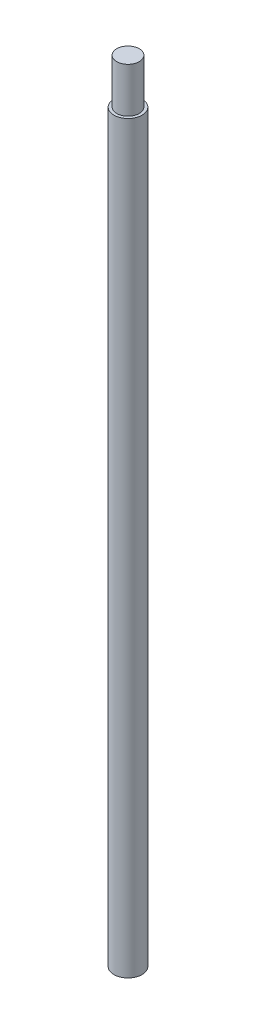
ISO-10303-21;
HEADER;
FILE_DESCRIPTION(('STEP AP214'),'2;1');
FILE_NAME('part.step','',(''),(''),'','','');
FILE_SCHEMA(('AUTOMOTIVE_DESIGN { 1 0 10303 214 1 1 1 1 }'));
ENDSEC;
DATA;
#1=APPLICATION_CONTEXT('core data for automotive mechanical design processes');
#2=APPLICATION_PROTOCOL_DEFINITION('international standard','automotive_design',2000,#1);
#3=PRODUCT_CONTEXT('',#1,'mechanical');
#4=PRODUCT('Part','Part','',(#3));
#5=PRODUCT_RELATED_PRODUCT_CATEGORY('part','',(#4));
#6=PRODUCT_DEFINITION_FORMATION('','',#4);
#7=PRODUCT_DEFINITION_CONTEXT('part definition',#1,'design');
#8=PRODUCT_DEFINITION('design','',#6,#7);
#9=PRODUCT_DEFINITION_SHAPE('','',#8);
#10=(LENGTH_UNIT() NAMED_UNIT(*) SI_UNIT(.MILLI.,.METRE.));
#11=(NAMED_UNIT(*) PLANE_ANGLE_UNIT() SI_UNIT($,.RADIAN.));
#12=(NAMED_UNIT(*) SI_UNIT($,.STERADIAN.) SOLID_ANGLE_UNIT());
#13=UNCERTAINTY_MEASURE_WITH_UNIT(LENGTH_MEASURE(1.E-05),#10,'distance_accuracy_value','');
#14=(GEOMETRIC_REPRESENTATION_CONTEXT(3) GLOBAL_UNCERTAINTY_ASSIGNED_CONTEXT((#13)) GLOBAL_UNIT_ASSIGNED_CONTEXT((#10,
#11,#12)) REPRESENTATION_CONTEXT('',''));
#15=CARTESIAN_POINT('',(0.,0.,0.));
#16=DIRECTION('',(0.,0.,1.));
#17=DIRECTION('',(1.,0.,0.));
#18=AXIS2_PLACEMENT_3D('',#15,#16,#17);
#19=CARTESIAN_POINT('',(0.,281.,0.));
#20=DIRECTION('',(0.,-1.,0.));
#21=DIRECTION('',(0.,0.,-1.));
#22=AXIS2_PLACEMENT_3D('',#19,#20,#21);
#23=CYLINDRICAL_SURFACE('',#22,5.);
#24=CARTESIAN_POINT('',(0.,0.,0.));
#25=DIRECTION('',(0.,1.,0.));
#26=DIRECTION('',(0.,0.,1.));
#27=AXIS2_PLACEMENT_3D('',#24,#25,#26);
#28=CIRCLE('',#27,5.);
#29=CARTESIAN_POINT('',(0.,0.,5.));
#30=VERTEX_POINT('',#29);
#31=EDGE_CURVE('E10',#30,#30,#28,.T.);
#32=ORIENTED_EDGE('',*,*,#31,.T.);
#33=EDGE_LOOP('',(#32));
#34=FACE_BOUND('',#33,.T.);
#35=CARTESIAN_POINT('',(0.,265.,0.));
#36=DIRECTION('',(0.,1.,0.));
#37=DIRECTION('',(0.,0.,1.));
#38=AXIS2_PLACEMENT_3D('',#35,#36,#37);
#39=CIRCLE('',#38,5.);
#40=CARTESIAN_POINT('',(0.,265.,5.));
#41=VERTEX_POINT('',#40);
#42=EDGE_CURVE('E33',#41,#41,#39,.T.);
#43=ORIENTED_EDGE('',*,*,#42,.F.);
#44=EDGE_LOOP('',(#43));
#45=FACE_BOUND('',#44,.T.);
#46=ADVANCED_FACE('F30',(#34,#45),#23,.T.);
#47=CARTESIAN_POINT('',(0.,0.,0.));
#48=DIRECTION('',(0.,1.,0.));
#49=DIRECTION('',(0.,0.,1.));
#50=AXIS2_PLACEMENT_3D('',#47,#48,#49);
#51=PLANE('',#50);
#52=ORIENTED_EDGE('',*,*,#31,.F.);
#53=EDGE_LOOP('',(#52));
#54=FACE_BOUND('',#53,.T.);
#55=ADVANCED_FACE('F54',(#54),#51,.F.);
#56=CARTESIAN_POINT('',(0.,265.,0.));
#57=DIRECTION('',(0.,1.,0.));
#58=DIRECTION('',(0.,0.,1.));
#59=AXIS2_PLACEMENT_3D('',#56,#57,#58);
#60=PLANE('',#59);
#61=CARTESIAN_POINT('',(0.,265.,0.));
#62=DIRECTION('',(0.,1.,0.));
#63=DIRECTION('',(0.,0.,1.));
#64=AXIS2_PLACEMENT_3D('',#61,#62,#63);
#65=CIRCLE('',#64,4.);
#66=CARTESIAN_POINT('',(0.,265.,4.));
#67=VERTEX_POINT('',#66);
#68=EDGE_CURVE('E40',#67,#67,#65,.T.);
#69=ORIENTED_EDGE('',*,*,#68,.F.);
#70=EDGE_LOOP('',(#69));
#71=FACE_BOUND('',#70,.T.);
#72=ORIENTED_EDGE('',*,*,#42,.T.);
#73=EDGE_LOOP('',(#72));
#74=FACE_BOUND('',#73,.T.);
#75=ADVANCED_FACE('F51',(#71,#74),#60,.T.);
#76=CARTESIAN_POINT('',(0.,265.,0.));
#77=DIRECTION('',(0.,1.,0.));
#78=DIRECTION('',(0.,0.,1.));
#79=AXIS2_PLACEMENT_3D('',#76,#77,#78);
#80=CYLINDRICAL_SURFACE('',#79,4.);
#81=ORIENTED_EDGE('',*,*,#68,.T.);
#82=EDGE_LOOP('',(#81));
#83=FACE_BOUND('',#82,.T.);
#84=CARTESIAN_POINT('',(0.,281.,0.));
#85=DIRECTION('',(0.,1.,0.));
#86=DIRECTION('',(0.,0.,1.));
#87=AXIS2_PLACEMENT_3D('',#84,#85,#86);
#88=CIRCLE('',#87,4.);
#89=CARTESIAN_POINT('',(0.,281.,4.));
#90=VERTEX_POINT('',#89);
#91=EDGE_CURVE('E42',#90,#90,#88,.T.);
#92=ORIENTED_EDGE('',*,*,#91,.F.);
#93=EDGE_LOOP('',(#92));
#94=FACE_BOUND('',#93,.T.);
#95=ADVANCED_FACE('F48',(#83,#94),#80,.T.);
#96=CARTESIAN_POINT('',(0.,281.,0.));
#97=DIRECTION('',(0.,1.,0.));
#98=DIRECTION('',(0.,0.,1.));
#99=AXIS2_PLACEMENT_3D('',#96,#97,#98);
#100=PLANE('',#99);
#101=ORIENTED_EDGE('',*,*,#91,.T.);
#102=EDGE_LOOP('',(#101));
#103=FACE_BOUND('',#102,.T.);
#104=ADVANCED_FACE('F66',(#103),#100,.T.);
#105=CLOSED_SHELL('',(#46,#55,#75,#95,#104));
#106=MANIFOLD_SOLID_BREP('B2',#105);
#107=ADVANCED_BREP_SHAPE_REPRESENTATION('',(#18,#106),#14);
#108=SHAPE_DEFINITION_REPRESENTATION(#9,#107);
ENDSEC;
END-ISO-10303-21;
